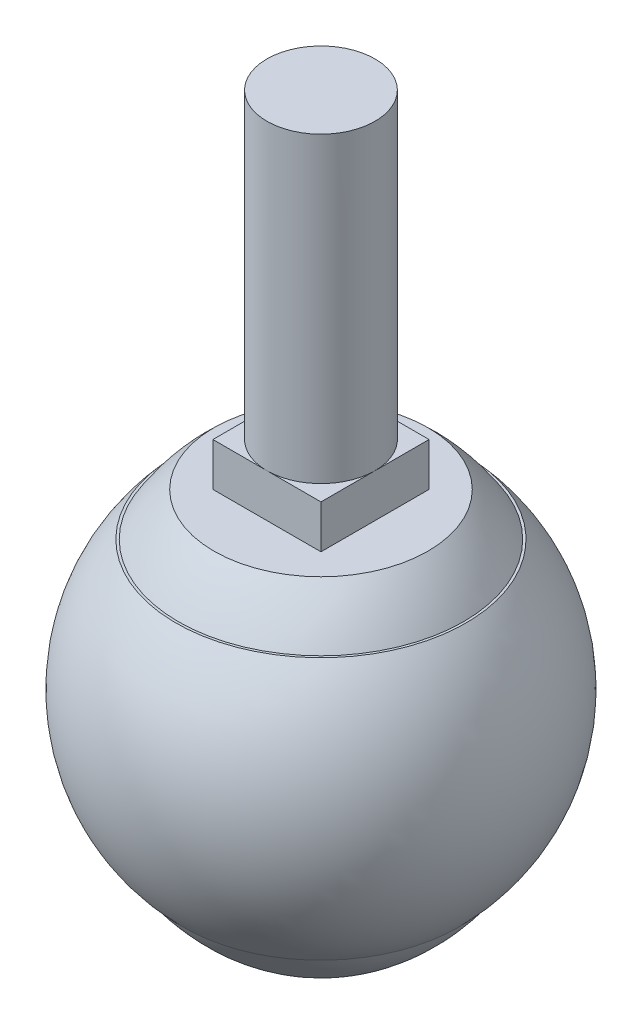
ISO-10303-21;
HEADER;
FILE_DESCRIPTION(('STEP AP214'),'2;1');
FILE_NAME('part.step','',(''),(''),'','','');
FILE_SCHEMA(('AUTOMOTIVE_DESIGN { 1 0 10303 214 1 1 1 1 }'));
ENDSEC;
DATA;
#1=APPLICATION_CONTEXT('core data for automotive mechanical design processes');
#2=APPLICATION_PROTOCOL_DEFINITION('international standard','automotive_design',2000,#1);
#3=PRODUCT_CONTEXT('',#1,'mechanical');
#4=PRODUCT('Part','Part','',(#3));
#5=PRODUCT_RELATED_PRODUCT_CATEGORY('part','',(#4));
#6=PRODUCT_DEFINITION_FORMATION('','',#4);
#7=PRODUCT_DEFINITION_CONTEXT('part definition',#1,'design');
#8=PRODUCT_DEFINITION('design','',#6,#7);
#9=PRODUCT_DEFINITION_SHAPE('','',#8);
#10=(LENGTH_UNIT() NAMED_UNIT(*) SI_UNIT(.MILLI.,.METRE.));
#11=(NAMED_UNIT(*) PLANE_ANGLE_UNIT() SI_UNIT($,.RADIAN.));
#12=(NAMED_UNIT(*) SI_UNIT($,.STERADIAN.) SOLID_ANGLE_UNIT());
#13=UNCERTAINTY_MEASURE_WITH_UNIT(LENGTH_MEASURE(1.E-05),#10,'distance_accuracy_value','');
#14=(GEOMETRIC_REPRESENTATION_CONTEXT(3) GLOBAL_UNCERTAINTY_ASSIGNED_CONTEXT((#13)) GLOBAL_UNIT_ASSIGNED_CONTEXT((#10,
#11,#12)) REPRESENTATION_CONTEXT('',''));
#15=CARTESIAN_POINT('',(0.,0.,0.));
#16=DIRECTION('',(0.,0.,1.));
#17=DIRECTION('',(1.,0.,0.));
#18=AXIS2_PLACEMENT_3D('',#15,#16,#17);
#19=CARTESIAN_POINT('',(0.,0.,0.));
#20=DIRECTION('',(0.,0.,1.));
#21=DIRECTION('',(0.,1.,0.));
#22=AXIS2_PLACEMENT_3D('',#19,#20,#21);
#23=ELLIPSE('',#22,10.,8.25);
#24=TRIMMED_CURVE('',#23,(PARAMETER_VALUE(3.1415926535898)),(PARAMETER_VALUE(6.28318530717959)),
.T.,.PARAMETER.);
#25=CARTESIAN_POINT('',(0.,8.,0.));
#26=DIRECTION('',(0.,1.,0.));
#27=AXIS1_PLACEMENT('',#25,#26);
#28=SURFACE_OF_REVOLUTION('',#24,#27);
#29=CARTESIAN_POINT('',(0.,7.99999999999999,0.));
#30=DIRECTION('',(0.,1.,0.));
#31=DIRECTION('',(-1.,0.,0.));
#32=AXIS2_PLACEMENT_3D('',#29,#30,#31);
#33=CIRCLE('',#32,4.94999999999999);
#34=CARTESIAN_POINT('',(-4.94999999999999,7.99999999999997,0.));
#35=VERTEX_POINT('',#34);
#36=EDGE_CURVE('E137',#35,#35,#33,.T.);
#37=ORIENTED_EDGE('',*,*,#36,.F.);
#38=EDGE_LOOP('',(#37));
#39=FACE_BOUND('',#38,.T.);
#40=CARTESIAN_POINT('',(0.,5.99999999999998,0.));
#41=DIRECTION('',(0.,1.,0.));
#42=DIRECTION('',(-1.,0.,0.));
#43=AXIS2_PLACEMENT_3D('',#40,#41,#42);
#44=CIRCLE('',#43,6.59999999999999);
#45=CARTESIAN_POINT('',(-6.59999999999998,5.99999999999996,0.));
#46=VERTEX_POINT('',#45);
#47=EDGE_CURVE('E59',#46,#46,#44,.F.);
#48=ORIENTED_EDGE('',*,*,#47,.F.);
#49=EDGE_LOOP('',(#48));
#50=FACE_BOUND('',#49,.T.);
#51=ADVANCED_FACE('F45',(#39,#50),#28,.T.);
#52=CARTESIAN_POINT('',(0.,9.99999999999999,0.));
#53=DIRECTION('',(0.,1.,0.));
#54=DIRECTION('',(-1.,0.,0.));
#55=AXIS2_PLACEMENT_3D('',#52,#53,#54);
#56=PLANE('',#55);
#57=CARTESIAN_POINT('',(0.,9.99999999999999,0.));
#58=DIRECTION('',(0.,1.,0.));
#59=DIRECTION('',(-1.,0.,0.));
#60=AXIS2_PLACEMENT_3D('',#57,#58,#59);
#61=CIRCLE('',#60,2.5);
#62=CARTESIAN_POINT('',(-2.50000000000003,9.99999999999999,0.));
#63=VERTEX_POINT('',#62);
#64=CARTESIAN_POINT('',(0.,9.99999999999999,2.5));
#65=VERTEX_POINT('',#64);
#66=EDGE_CURVE('E127',#63,#65,#61,.T.);
#67=ORIENTED_EDGE('',*,*,#66,.F.);
#68=DIRECTION('',(0.,0.,1.));
#69=VECTOR('',#68,1.);
#70=CARTESIAN_POINT('',(-2.50000000000003,9.99999999999999,2.5));
#71=LINE('',#70,#69);
#72=CARTESIAN_POINT('',(-2.50000000000003,9.99999999999999,2.5));
#73=VERTEX_POINT('',#72);
#74=EDGE_CURVE('E114',#63,#73,#71,.T.);
#75=ORIENTED_EDGE('',*,*,#74,.T.);
#76=DIRECTION('',(1.,0.,0.));
#77=VECTOR('',#76,1.);
#78=CARTESIAN_POINT('',(2.49999999999997,10.,2.5));
#79=LINE('',#78,#77);
#80=EDGE_CURVE('E129',#73,#65,#79,.T.);
#81=ORIENTED_EDGE('',*,*,#80,.T.);
#82=EDGE_LOOP('',(#67,#75,#81));
#83=FACE_BOUND('',#82,.T.);
#84=ADVANCED_FACE('F128',(#83),#56,.T.);
#85=CARTESIAN_POINT('',(2.49999999999997,10.,0.));
#86=VERTEX_POINT('',#85);
#87=EDGE_CURVE('E135',#65,#86,#61,.T.);
#88=ORIENTED_EDGE('',*,*,#87,.F.);
#89=CARTESIAN_POINT('',(2.49999999999997,10.,2.5));
#90=VERTEX_POINT('',#89);
#91=EDGE_CURVE('E113',#65,#90,#79,.T.);
#92=ORIENTED_EDGE('',*,*,#91,.T.);
#93=DIRECTION('',(0.,0.,-1.));
#94=VECTOR('',#93,1.);
#95=CARTESIAN_POINT('',(2.49999999999997,10.,2.5));
#96=LINE('',#95,#94);
#97=EDGE_CURVE('E145',#90,#86,#96,.T.);
#98=ORIENTED_EDGE('',*,*,#97,.T.);
#99=EDGE_LOOP('',(#88,#92,#98));
#100=FACE_BOUND('',#99,.T.);
#101=ADVANCED_FACE('F174',(#100),#56,.T.);
#102=CARTESIAN_POINT('',(0.,9.99999999999999,-2.5));
#103=VERTEX_POINT('',#102);
#104=EDGE_CURVE('E74',#86,#103,#61,.T.);
#105=ORIENTED_EDGE('',*,*,#104,.F.);
#106=CARTESIAN_POINT('',(2.49999999999997,10.,-2.5));
#107=VERTEX_POINT('',#106);
#108=EDGE_CURVE('E144',#86,#107,#96,.T.);
#109=ORIENTED_EDGE('',*,*,#108,.T.);
#110=DIRECTION('',(-1.,0.,0.));
#111=VECTOR('',#110,1.);
#112=CARTESIAN_POINT('',(2.49999999999997,10.,-2.5));
#113=LINE('',#112,#111);
#114=EDGE_CURVE('E148',#107,#103,#113,.T.);
#115=ORIENTED_EDGE('',*,*,#114,.T.);
#116=EDGE_LOOP('',(#105,#109,#115));
#117=FACE_BOUND('',#116,.T.);
#118=ADVANCED_FACE('F183',(#117),#56,.T.);
#119=CARTESIAN_POINT('',(0.,7.99999999999999,0.));
#120=DIRECTION('',(0.,-1.,0.));
#121=DIRECTION('',(1.,0.,0.));
#122=AXIS2_PLACEMENT_3D('',#119,#120,#121);
#123=PLANE('',#122);
#124=ORIENTED_EDGE('',*,*,#36,.T.);
#125=EDGE_LOOP('',(#124));
#126=FACE_BOUND('',#125,.T.);
#127=DIRECTION('',(0.,0.,1.));
#128=VECTOR('',#127,1.);
#129=CARTESIAN_POINT('',(-2.50000000000002,7.99999999999999,2.5));
#130=LINE('',#129,#128);
#131=CARTESIAN_POINT('',(-2.50000000000002,7.99999999999999,-2.5));
#132=VERTEX_POINT('',#131);
#133=CARTESIAN_POINT('',(-2.50000000000003,7.99999999999999,2.5));
#134=VERTEX_POINT('',#133);
#135=EDGE_CURVE('E151',#132,#134,#130,.T.);
#136=ORIENTED_EDGE('',*,*,#135,.F.);
#137=DIRECTION('',(-1.,0.,0.));
#138=VECTOR('',#137,1.);
#139=CARTESIAN_POINT('',(2.49999999999998,8.,-2.5));
#140=LINE('',#139,#138);
#141=CARTESIAN_POINT('',(2.49999999999998,8.,-2.5));
#142=VERTEX_POINT('',#141);
#143=EDGE_CURVE('E125',#142,#132,#140,.T.);
#144=ORIENTED_EDGE('',*,*,#143,.F.);
#145=DIRECTION('',(0.,0.,-1.));
#146=VECTOR('',#145,1.);
#147=CARTESIAN_POINT('',(2.49999999999998,8.,2.5));
#148=LINE('',#147,#146);
#149=CARTESIAN_POINT('',(2.49999999999998,8.,2.5));
#150=VERTEX_POINT('',#149);
#151=EDGE_CURVE('E156',#150,#142,#148,.T.);
#152=ORIENTED_EDGE('',*,*,#151,.F.);
#153=DIRECTION('',(1.,0.,0.));
#154=VECTOR('',#153,1.);
#155=CARTESIAN_POINT('',(2.49999999999998,8.,2.5));
#156=LINE('',#155,#154);
#157=EDGE_CURVE('E153',#134,#150,#156,.T.);
#158=ORIENTED_EDGE('',*,*,#157,.F.);
#159=EDGE_LOOP('',(#136,#144,#152,#158));
#160=FACE_BOUND('',#159,.T.);
#161=ADVANCED_FACE('F187',(#126,#160),#123,.F.);
#162=CARTESIAN_POINT('',(-2.50000000000003,9.99999999999999,2.5));
#163=DIRECTION('',(1.,0.,0.));
#164=DIRECTION('',(0.,1.,0.));
#165=AXIS2_PLACEMENT_3D('',#162,#163,#164);
#166=PLANE('',#165);
#167=ORIENTED_EDGE('',*,*,#135,.T.);
#168=DIRECTION('',(0.,-1.,0.));
#169=VECTOR('',#168,1.);
#170=CARTESIAN_POINT('',(-2.50000000000003,9.99999999999999,2.5));
#171=LINE('',#170,#169);
#172=EDGE_CURVE('E121',#73,#134,#171,.T.);
#173=ORIENTED_EDGE('',*,*,#172,.F.);
#174=ORIENTED_EDGE('',*,*,#74,.F.);
#175=CARTESIAN_POINT('',(-2.50000000000003,9.99999999999999,-2.5));
#176=VERTEX_POINT('',#175);
#177=EDGE_CURVE('E106',#176,#63,#71,.T.);
#178=ORIENTED_EDGE('',*,*,#177,.F.);
#179=DIRECTION('',(0.,-1.,0.));
#180=VECTOR('',#179,1.);
#181=CARTESIAN_POINT('',(-2.50000000000003,9.99999999999999,-2.5));
#182=LINE('',#181,#180);
#183=EDGE_CURVE('E150',#176,#132,#182,.T.);
#184=ORIENTED_EDGE('',*,*,#183,.T.);
#185=EDGE_LOOP('',(#167,#173,#174,#178,#184));
#186=FACE_BOUND('',#185,.T.);
#187=ADVANCED_FACE('F119',(#186),#166,.F.);
#188=CARTESIAN_POINT('',(2.49999999999997,10.,2.5));
#189=DIRECTION('',(0.,0.,-1.));
#190=DIRECTION('',(-1.,0.,0.));
#191=AXIS2_PLACEMENT_3D('',#188,#189,#190);
#192=PLANE('',#191);
#193=ORIENTED_EDGE('',*,*,#157,.T.);
#194=DIRECTION('',(0.,-1.,0.));
#195=VECTOR('',#194,1.);
#196=CARTESIAN_POINT('',(2.49999999999997,10.,2.5));
#197=LINE('',#196,#195);
#198=EDGE_CURVE('E165',#90,#150,#197,.T.);
#199=ORIENTED_EDGE('',*,*,#198,.F.);
#200=ORIENTED_EDGE('',*,*,#91,.F.);
#201=ORIENTED_EDGE('',*,*,#80,.F.);
#202=ORIENTED_EDGE('',*,*,#172,.T.);
#203=EDGE_LOOP('',(#193,#199,#200,#201,#202));
#204=FACE_BOUND('',#203,.T.);
#205=ADVANCED_FACE('F178',(#204),#192,.F.);
#206=CARTESIAN_POINT('',(2.49999999999997,10.,2.5));
#207=DIRECTION('',(-1.,0.,0.));
#208=DIRECTION('',(0.,-1.,0.));
#209=AXIS2_PLACEMENT_3D('',#206,#207,#208);
#210=PLANE('',#209);
#211=ORIENTED_EDGE('',*,*,#151,.T.);
#212=DIRECTION('',(0.,-1.,0.));
#213=VECTOR('',#212,1.);
#214=CARTESIAN_POINT('',(2.49999999999997,10.,-2.5));
#215=LINE('',#214,#213);
#216=EDGE_CURVE('E162',#107,#142,#215,.T.);
#217=ORIENTED_EDGE('',*,*,#216,.F.);
#218=ORIENTED_EDGE('',*,*,#108,.F.);
#219=ORIENTED_EDGE('',*,*,#97,.F.);
#220=ORIENTED_EDGE('',*,*,#198,.T.);
#221=EDGE_LOOP('',(#211,#217,#218,#219,#220));
#222=FACE_BOUND('',#221,.T.);
#223=ADVANCED_FACE('F180',(#222),#210,.F.);
#224=CARTESIAN_POINT('',(2.49999999999997,10.,-2.5));
#225=DIRECTION('',(0.,0.,1.));
#226=DIRECTION('',(1.,0.,0.));
#227=AXIS2_PLACEMENT_3D('',#224,#225,#226);
#228=PLANE('',#227);
#229=ORIENTED_EDGE('',*,*,#143,.T.);
#230=ORIENTED_EDGE('',*,*,#183,.F.);
#231=EDGE_CURVE('E109',#103,#176,#113,.T.);
#232=ORIENTED_EDGE('',*,*,#231,.F.);
#233=ORIENTED_EDGE('',*,*,#114,.F.);
#234=ORIENTED_EDGE('',*,*,#216,.T.);
#235=EDGE_LOOP('',(#229,#230,#232,#233,#234));
#236=FACE_BOUND('',#235,.T.);
#237=ADVANCED_FACE('F185',(#236),#228,.F.);
#238=EDGE_CURVE('E66',#103,#63,#61,.T.);
#239=ORIENTED_EDGE('',*,*,#238,.F.);
#240=ORIENTED_EDGE('',*,*,#231,.T.);
#241=ORIENTED_EDGE('',*,*,#177,.T.);
#242=EDGE_LOOP('',(#239,#240,#241));
#243=FACE_BOUND('',#242,.T.);
#244=ADVANCED_FACE('F108',(#243),#56,.T.);
#245=CARTESIAN_POINT('',(0.,24.,0.));
#246=DIRECTION('',(0.,-1.,0.));
#247=DIRECTION('',(1.,0.,0.));
#248=AXIS2_PLACEMENT_3D('',#245,#246,#247);
#249=CYLINDRICAL_SURFACE('',#248,2.5);
#250=CARTESIAN_POINT('',(0.,24.,0.));
#251=DIRECTION('',(0.,1.,0.));
#252=DIRECTION('',(-1.,0.,0.));
#253=AXIS2_PLACEMENT_3D('',#250,#251,#252);
#254=CIRCLE('',#253,2.5);
#255=CARTESIAN_POINT('',(-2.50000000000007,24.,0.));
#256=VERTEX_POINT('',#255);
#257=EDGE_CURVE('E132',#256,#256,#254,.T.);
#258=ORIENTED_EDGE('',*,*,#257,.F.);
#259=EDGE_LOOP('',(#258));
#260=FACE_BOUND('',#259,.T.);
#261=ORIENTED_EDGE('',*,*,#66,.T.);
#262=ORIENTED_EDGE('',*,*,#87,.T.);
#263=ORIENTED_EDGE('',*,*,#104,.T.);
#264=ORIENTED_EDGE('',*,*,#238,.T.);
#265=EDGE_LOOP('',(#261,#262,#263,#264));
#266=FACE_BOUND('',#265,.T.);
#267=ADVANCED_FACE('F136',(#260,#266),#249,.T.);
#268=CARTESIAN_POINT('',(0.,24.,0.));
#269=DIRECTION('',(0.,1.,0.));
#270=DIRECTION('',(-1.,0.,0.));
#271=AXIS2_PLACEMENT_3D('',#268,#269,#270);
#272=PLANE('',#271);
#273=ORIENTED_EDGE('',*,*,#257,.T.);
#274=EDGE_LOOP('',(#273));
#275=FACE_BOUND('',#274,.T.);
#276=ADVANCED_FACE('F215',(#275),#272,.T.);
#277=CARTESIAN_POINT('',(-0.00146411237267257,0.,0.));
#278=DIRECTION('',(0.,1.,0.));
#279=DIRECTION('',(-1.,0.,0.));
#280=AXIS2_PLACEMENT_3D('',#277,#278,#279);
#281=DEGENERATE_TOROIDAL_SURFACE('',#280,0.00146411237267257,9.,.T.);
#282=CARTESIAN_POINT('',(-0.0014641123726733,6.,0.));
#283=DIRECTION('',(0.,1.,0.));
#284=DIRECTION('',(-1.,0.,0.));
#285=AXIS2_PLACEMENT_3D('',#282,#283,#284);
#286=CIRCLE('',#285,6.70966804487204);
#287=CARTESIAN_POINT('',(-6.71113215724471,6.,0.));
#288=VERTEX_POINT('',#287);
#289=EDGE_CURVE('E133',#288,#288,#286,.T.);
#290=ORIENTED_EDGE('',*,*,#289,.F.);
#291=EDGE_LOOP('',(#290));
#292=FACE_BOUND('',#291,.T.);
#293=CARTESIAN_POINT('',(6.36326910775972,-6.36465287837686,0.));
#294=CARTESIAN_POINT('',(6.36326389244827,-6.36465288213509,-0.315135987851063));
#295=CARTESIAN_POINT('',(6.3398061278726,-6.3646697660967,-0.630343910301666));
#296=CARTESIAN_POINT('',(6.24637255461894,-6.36473701503696,-1.25410045553155));
#297=CARTESIAN_POINT('',(6.17636193550676,-6.36478740507016,-1.56264391648955));
#298=CARTESIAN_POINT('',(6.0315554246293,-6.36489162731706,-2.03507280525827));
#299=CARTESIAN_POINT('',(5.97194864277216,-6.36493452806366,-2.20376376390776));
#300=CARTESIAN_POINT('',(5.83872463757168,-6.36503041202051,-2.53557681675508));
#301=CARTESIAN_POINT('',(5.76510612624529,-6.36508339615765,-2.6986983973788));
#302=CARTESIAN_POINT('',(5.604392100065,-6.36519906236882,-3.01815041315301));
#303=CARTESIAN_POINT('',(5.51729661278665,-6.365261744423,-3.17448086219816));
#304=CARTESIAN_POINT('',(5.33021248883217,-6.36539638524311,-3.4793065100732));
#305=CARTESIAN_POINT('',(5.23021926381908,-6.36546834731038,-3.627798893911));
#306=CARTESIAN_POINT('',(5.01812326339627,-6.36562098353,-3.91576411563672));
#307=CARTESIAN_POINT('',(4.90602593295032,-6.36570165376502,-4.05524096434429));
#308=CARTESIAN_POINT('',(4.67043812738383,-6.36587118956143,-4.32430699542424));
#309=CARTESIAN_POINT('',(4.54694347077857,-6.36596005813064,-4.45389251672426));
#310=CARTESIAN_POINT('',(4.28952856387424,-6.36614529358794,-4.70214488338805));
#311=CARTESIAN_POINT('',(4.15561270751275,-6.3662416573158,-4.82081628496477));
#312=CARTESIAN_POINT('',(3.8782104858122,-6.36644126655974,-5.04650013468462));
#313=CARTESIAN_POINT('',(3.73472060600546,-6.36654451460291,-5.15350826304716));
#314=CARTESIAN_POINT('',(3.43928658758556,-6.36675708857974,-5.35501902559241));
#315=CARTESIAN_POINT('',(3.28734541069756,-6.36686641238417,-5.44952600202081));
#316=CARTESIAN_POINT('',(2.97598540995332,-6.36709043406633,-5.62543920167404));
#317=CARTESIAN_POINT('',(2.81656384599842,-6.36720513391333,-5.7068405751073));
#318=CARTESIAN_POINT('',(2.49148747370382,-6.36743901181001,-5.8558945850169));
#319=CARTESIAN_POINT('',(2.32583492585104,-6.36755818823567,-5.92355215155593));
#320=CARTESIAN_POINT('',(1.98935766105275,-6.36780025497827,-6.04469681878833));
#321=CARTESIAN_POINT('',(1.81853105709572,-6.36792314665016,-6.09817867844861));
#322=CARTESIAN_POINT('',(1.47304354044422,-6.36817168111889,-6.19054138547918));
#323=CARTESIAN_POINT('',(1.2983840819265,-6.36829732287232,-6.22942767236784));
#324=CARTESIAN_POINT('',(0.946345671581072,-6.36855055489691,-6.29236279285679));
#325=CARTESIAN_POINT('',(0.768965739527204,-6.36867814587035,-6.31640614318705));
#326=CARTESIAN_POINT('',(0.41287600273314,-6.36893427675022,-6.34945514276069));
#327=CARTESIAN_POINT('',(0.234166714816056,-6.36906281628773,-6.35846635766694));
#328=CARTESIAN_POINT('',(-0.123438722634823,-6.36932002182818,-6.36140677999631));
#329=CARTESIAN_POINT('',(-0.302334916798317,-6.36944868786029,-6.35533041791127));
#330=CARTESIAN_POINT('',(-0.658925400294313,-6.36970514785849,-6.32812503943747));
#331=CARTESIAN_POINT('',(-0.83662010798979,-6.36983294212828,-6.30700156731219));
#332=CARTESIAN_POINT('',(-1.1896193756592,-6.37008680407683,-6.24987444268177));
#333=CARTESIAN_POINT('',(-1.36492302896689,-6.37021287110071,-6.21386529927934));
#334=CARTESIAN_POINT('',(-1.88522616610444,-6.37058702847788,-6.0838438861773));
#335=CARTESIAN_POINT('',(-2.22500543374098,-6.37083135390163,-5.96780770919574));
#336=CARTESIAN_POINT('',(-2.88007194947979,-6.37130236777804,-5.68039248945061));
#337=CARTESIAN_POINT('',(-3.19535919915607,-6.37152905623182,-5.50901345024372));
#338=CARTESIAN_POINT('',(-3.79273712436017,-6.37195854443361,-5.11574104764191));
#339=CARTESIAN_POINT('',(-4.07482779597003,-6.37216134417879,-4.89384767828515));
#340=CARTESIAN_POINT('',(-4.59773895808771,-6.37253725835657,-4.40585532386046));
#341=CARTESIAN_POINT('',(-4.83855945740775,-6.3727103727955,-4.13975634823158));
#342=CARTESIAN_POINT('',(-5.27211176556438,-6.37302202272918,-3.57090391786511));
#343=CARTESIAN_POINT('',(-5.46484357711028,-6.37316055822587,-3.26815046519265));
#344=CARTESIAN_POINT('',(-5.79674266729804,-6.37339912139448,-2.63458412370709));
#345=CARTESIAN_POINT('',(-5.93590995829778,-6.37349914907527,-2.30377124136761));
#346=CARTESIAN_POINT('',(-6.15673078229914,-6.37365786371686,-1.62347659438735));
#347=CARTESIAN_POINT('',(-6.23838431455806,-6.37371655067712,-1.27399482950549));
#348=CARTESIAN_POINT('',(-6.34185935239999,-6.37379092116202,-0.566283315753659));
#349=CARTESIAN_POINT('',(-6.36368087151346,-6.37380660469637,-0.208053568861981));
#350=CARTESIAN_POINT('',(-6.34687258734024,-6.37379452418807,0.506984911411205));
#351=CARTESIAN_POINT('',(-6.30824278308124,-6.37376676014471,0.863793644769856));
#352=CARTESIAN_POINT('',(-6.17162832624488,-6.37366857085049,1.56586132872532));
#353=CARTESIAN_POINT('',(-6.07364367643536,-6.37359814560162,1.91112027986071));
#354=CARTESIAN_POINT('',(-5.82110138863011,-6.37341662917793,2.5802874717813));
#355=CARTESIAN_POINT('',(-5.66654375512525,-6.37330553800634,2.90419571426136));
#356=CARTESIAN_POINT('',(-5.30524166505758,-6.37304583623706,3.52146685007804));
#357=CARTESIAN_POINT('',(-5.09849720843158,-6.37289722563931,3.8148297433777));
#358=CARTESIAN_POINT('',(-4.63869503381129,-6.37256669957601,4.36268207263595));
#359=CARTESIAN_POINT('',(-4.38563730398034,-6.37238478410194,4.61717149865933));
#360=CARTESIAN_POINT('',(-3.84037434352249,-6.37199279162061,5.08005448309934));
#361=CARTESIAN_POINT('',(-3.54816909640231,-6.37178271460147,5.28844802209519));
#362=CARTESIAN_POINT('',(-2.93297240119046,-6.37134040283593,5.65321665389151));
#363=CARTESIAN_POINT('',(-2.60998097349495,-6.37110816810421,5.8095917811544));
#364=CARTESIAN_POINT('',(-1.9421336093119,-6.370627949393,6.06590956445785));
#365=CARTESIAN_POINT('',(-1.59727767241499,-6.37037996541321,6.16585221944182));
#366=CARTESIAN_POINT('',(-1.07144007816401,-6.37000181567138,6.27128241586007));
#367=CARTESIAN_POINT('',(-0.894638022144981,-6.36987466685613,6.29901477294211));
#368=CARTESIAN_POINT('',(-0.539344283323472,-6.3696191462731,6.33949237081834));
#369=CARTESIAN_POINT('',(-0.360853248183796,-6.36949077497398,6.3522431390443));
#370=CARTESIAN_POINT('',(-0.00337824260409242,-6.36923367015498,6.36266327696797));
#371=CARTESIAN_POINT('',(0.175605885118593,-6.36910493651915,6.36032709271201));
#372=CARTESIAN_POINT('',(0.532678211291081,-6.36884810574397,6.34058703001049));
#373=CARTESIAN_POINT('',(0.710766716017173,-6.36872000838726,6.32318871282978));
#374=CARTESIAN_POINT('',(1.06491030577796,-6.36846526879791,6.27344454036167));
#375=CARTESIAN_POINT('',(1.24096461294532,-6.36833862712201,6.24109314913017));
#376=CARTESIAN_POINT('',(1.58965709267892,-6.36808779362198,6.16168621665437));
#377=CARTESIAN_POINT('',(1.76229650202388,-6.36796360091096,6.11463610652838));
#378=CARTESIAN_POINT('',(2.10306394412371,-6.36771845398665,6.0061414631392));
#379=CARTESIAN_POINT('',(2.27119023265289,-6.3675975010255,5.94469145140792));
#380=CARTESIAN_POINT('',(2.60160615658558,-6.36735978740838,5.80786912659628));
#381=CARTESIAN_POINT('',(2.76389792325414,-6.36724302522162,5.7325019602692));
#382=CARTESIAN_POINT('',(3.08161150490025,-6.36701443757716,5.56833764485707));
#383=CARTESIAN_POINT('',(3.23703093593803,-6.36690261383257,5.47953588195709));
#384=CARTESIAN_POINT('',(3.53977901827241,-6.36668478205039,5.28918818713326));
#385=CARTESIAN_POINT('',(3.68711063466242,-6.36657877188148,5.18764697111612));
#386=CARTESIAN_POINT('',(3.97274126399779,-6.36637324610167,4.97248360032872));
#387=CARTESIAN_POINT('',(4.11103752989532,-6.36627373246594,4.85885779878028));
#388=CARTESIAN_POINT('',(4.37751599743708,-6.36608197865416,4.62040265436802));
#389=CARTESIAN_POINT('',(4.50570191186729,-6.3659897358081,4.49557746054888));
#390=CARTESIAN_POINT('',(4.75117022753,-6.36581309290363,4.23550610499194));
#391=CARTESIAN_POINT('',(4.86844685158735,-6.36572869700071,4.10025449033823));
#392=CARTESIAN_POINT('',(5.09114498746448,-6.36556843350986,3.82040183317485));
#393=CARTESIAN_POINT('',(5.19657085025954,-6.36549256279193,3.67580425292384));
#394=CARTESIAN_POINT('',(5.39493420028327,-6.36534980659049,3.37814273121479));
#395=CARTESIAN_POINT('',(5.48786331002616,-6.36528292713447,3.22507320647571));
#396=CARTESIAN_POINT('',(5.66045733011794,-6.36515871244655,2.91170434099686));
#397=CARTESIAN_POINT('',(5.74012701482803,-6.36510137377926,2.75140762910973));
#398=CARTESIAN_POINT('',(5.8856414377164,-6.36499664523773,2.42474483104025));
#399=CARTESIAN_POINT('',(5.95149293613373,-6.36494925049864,2.25838175966846));
#400=CARTESIAN_POINT('',(6.06893845680039,-6.36486472162865,1.92075662748794));
#401=CARTESIAN_POINT('',(6.12053509211972,-6.36482758561721,1.74949547091123));
#402=CARTESIAN_POINT('',(6.23062292496769,-6.36474835086305,1.31912943675945));
#403=CARTESIAN_POINT('',(6.28031511001395,-6.36471258487307,1.05771624798675));
#404=CARTESIAN_POINT('',(6.34663540383414,-6.36466485064161,0.530884898774381));
#405=CARTESIAN_POINT('',(6.36327350109532,-6.36465287521096,0.265467972644448));
#406=CARTESIAN_POINT('',(6.36326910775972,-6.36465287837686,0.));
#407=B_SPLINE_CURVE_WITH_KNOTS('',3,(#293,#294,#295,#296,#297,#298,#299,#300,#301,#302,#303,
#304,#305,#306,#307,#308,#309,#310,#311,#312,#313,#314,#315,#316,#317,#318,#319,#320,#321,#322,
#323,#324,#325,#326,#327,#328,#329,#330,#331,#332,#333,#334,#335,#336,#337,#338,#339,#340,#341,
#342,#343,#344,#345,#346,#347,#348,#349,#350,#351,#352,#353,#354,#355,#356,#357,#358,#359,#360,
#361,#362,#363,#364,#365,#366,#367,#368,#369,#370,#371,#372,#373,#374,#375,#376,#377,#378,#379,
#380,#381,#382,#383,#384,#385,#386,#387,#388,#389,#390,#391,#392,#393,#394,#395,#396,#397,#398,
#399,#400,#401,#402,#403,#404,#405,#406),.UNSPECIFIED.,.T.,.F.,(4,2,2,2,2,2,2,2,2,2,2,2,2,2,2,2,
2,2,2,2,2,2,2,2,2,2,2,2,2,2,2,2,2,2,2,2,2,2,2,2,2,2,2,2,2,2,2,2,2,2,2,2,2,2,2,2,4),(0.,
0.944714508886397,1.89013623455306,2.42632238624137,2.96255784893777,3.49879221444469,
4.03521787280967,4.5714032205635,5.10778607358589,5.64394398183633,6.18029979937649,
6.71646882301853,7.25283580479834,7.78901004445032,8.32538224245146,8.86155434482931,
9.39792440128857,9.93409582209505,10.4704651974858,11.0066370441843,11.5430068460341,
12.6145948705146,13.6861828261282,14.7577709082136,15.8293587614875,16.9009465543879,
17.9725341000619,19.044121659574,20.1157089767563,21.187296311174,22.2588835956216,
23.3304707950047,24.4020579956848,25.4736454702392,26.5452333962661,27.6168206123601,
28.6884078485172,29.2247778310291,29.7609498585445,30.2973192780988,30.8334907428974,
31.3698608688995,31.9060330422058,32.4424095353003,32.9785880648796,33.5149511528761,
34.0511162719363,34.5874436516871,35.1235731519825,35.6599849702135,36.1961991985539,
36.7327711173004,37.2691494110049,37.8052646786375,38.341281605259,39.1373419576857,
39.9331617150928),.UNSPECIFIED.);
#408=CARTESIAN_POINT('',(6.36326910775972,-6.36465287837686,0.));
#409=VERTEX_POINT('',#408);
#410=EDGE_CURVE('E11',#409,#409,#407,.T.);
#411=ORIENTED_EDGE('',*,*,#410,.T.);
#412=EDGE_LOOP('',(#411));
#413=FACE_BOUND('',#412,.T.);
#414=ADVANCED_FACE('F209',(#292,#413),#281,.T.);
#415=CARTESIAN_POINT('',(-0.0014641123726733,6.,0.));
#416=DIRECTION('',(0.,-1.,0.));
#417=DIRECTION('',(1.,0.,0.));
#418=AXIS2_PLACEMENT_3D('',#415,#416,#417);
#419=PLANE('',#418);
#420=ORIENTED_EDGE('',*,*,#47,.T.);
#421=EDGE_LOOP('',(#420));
#422=FACE_BOUND('',#421,.T.);
#423=ORIENTED_EDGE('',*,*,#289,.T.);
#424=EDGE_LOOP('',(#423));
#425=FACE_BOUND('',#424,.T.);
#426=ADVANCED_FACE('F204',(#422,#425),#419,.F.);
#427=CARTESIAN_POINT('',(0.,-10.,0.));
#428=VERTEX_POINT('',#427);
#429=VERTEX_LOOP('',#428);
#430=FACE_BOUND('',#429,.T.);
#431=ORIENTED_EDGE('',*,*,#410,.F.);
#432=EDGE_LOOP('',(#431));
#433=FACE_BOUND('',#432,.T.);
#434=ADVANCED_FACE('F47',(#430,#433),#28,.T.);
#435=CLOSED_SHELL('',(#51,#84,#101,#118,#161,#187,#205,#223,#237,#244,#267,#276,#414,#426,#434));
#436=MANIFOLD_SOLID_BREP('B2',#435);
#437=ADVANCED_BREP_SHAPE_REPRESENTATION('',(#18,#436),#14);
#438=SHAPE_DEFINITION_REPRESENTATION(#9,#437);
ENDSEC;
END-ISO-10303-21;
